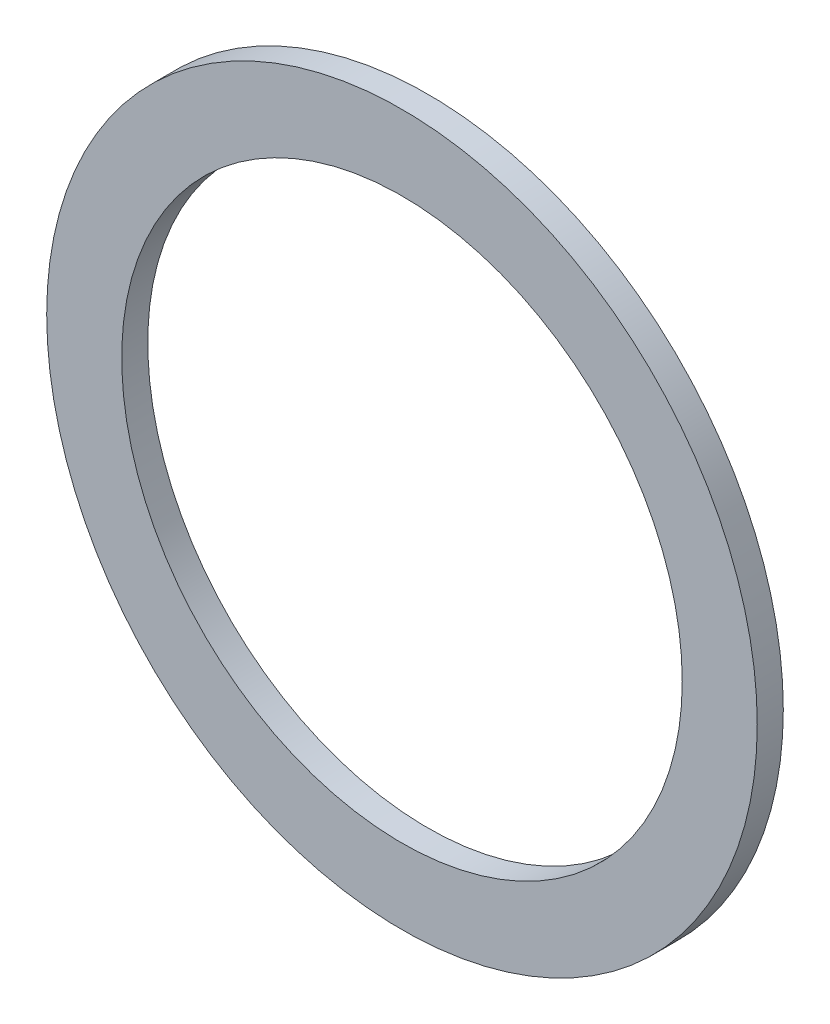
ISO-10303-21;
HEADER;
FILE_DESCRIPTION(('STEP AP214'),'2;1');
FILE_NAME('part.step','',(''),(''),'','','');
FILE_SCHEMA(('AUTOMOTIVE_DESIGN { 1 0 10303 214 1 1 1 1 }'));
ENDSEC;
DATA;
#1=APPLICATION_CONTEXT('core data for automotive mechanical design processes');
#2=APPLICATION_PROTOCOL_DEFINITION('international standard','automotive_design',2000,#1);
#3=PRODUCT_CONTEXT('',#1,'mechanical');
#4=PRODUCT('Part','Part','',(#3));
#5=PRODUCT_RELATED_PRODUCT_CATEGORY('part','',(#4));
#6=PRODUCT_DEFINITION_FORMATION('','',#4);
#7=PRODUCT_DEFINITION_CONTEXT('part definition',#1,'design');
#8=PRODUCT_DEFINITION('design','',#6,#7);
#9=PRODUCT_DEFINITION_SHAPE('','',#8);
#10=(LENGTH_UNIT() NAMED_UNIT(*) SI_UNIT(.MILLI.,.METRE.));
#11=(NAMED_UNIT(*) PLANE_ANGLE_UNIT() SI_UNIT($,.RADIAN.));
#12=(NAMED_UNIT(*) SI_UNIT($,.STERADIAN.) SOLID_ANGLE_UNIT());
#13=UNCERTAINTY_MEASURE_WITH_UNIT(LENGTH_MEASURE(1.E-05),#10,'distance_accuracy_value','');
#14=(GEOMETRIC_REPRESENTATION_CONTEXT(3) GLOBAL_UNCERTAINTY_ASSIGNED_CONTEXT((#13)) GLOBAL_UNIT_ASSIGNED_CONTEXT((#10,
#11,#12)) REPRESENTATION_CONTEXT('',''));
#15=CARTESIAN_POINT('',(0.,0.,0.));
#16=DIRECTION('',(0.,0.,1.));
#17=DIRECTION('',(1.,0.,0.));
#18=AXIS2_PLACEMENT_3D('',#15,#16,#17);
#19=CARTESIAN_POINT('',(0.,0.,1.65));
#20=DIRECTION('',(0.,0.,1.));
#21=DIRECTION('',(1.,0.,0.));
#22=AXIS2_PLACEMENT_3D('',#19,#20,#21);
#23=PLANE('',#22);
#24=CARTESIAN_POINT('',(0.,0.,1.65));
#25=DIRECTION('',(0.,0.,1.));
#26=DIRECTION('',(1.,0.,0.));
#27=AXIS2_PLACEMENT_3D('',#24,#25,#26);
#28=CIRCLE('',#27,22.5);
#29=CARTESIAN_POINT('',(22.5,0.,1.65));
#30=VERTEX_POINT('',#29);
#31=EDGE_CURVE('E10',#30,#30,#28,.T.);
#32=ORIENTED_EDGE('',*,*,#31,.T.);
#33=EDGE_LOOP('',(#32));
#34=FACE_BOUND('',#33,.T.);
#35=CARTESIAN_POINT('',(0.,0.,1.65));
#36=DIRECTION('',(0.,0.,1.));
#37=DIRECTION('',(1.,0.,0.));
#38=AXIS2_PLACEMENT_3D('',#35,#36,#37);
#39=CIRCLE('',#38,17.75);
#40=CARTESIAN_POINT('',(17.75,0.,1.65));
#41=VERTEX_POINT('',#40);
#42=EDGE_CURVE('E44',#41,#41,#39,.T.);
#43=ORIENTED_EDGE('',*,*,#42,.F.);
#44=EDGE_LOOP('',(#43));
#45=FACE_BOUND('',#44,.T.);
#46=ADVANCED_FACE('F33',(#34,#45),#23,.T.);
#47=CARTESIAN_POINT('',(0.,0.,0.));
#48=DIRECTION('',(0.,0.,1.));
#49=DIRECTION('',(1.,0.,0.));
#50=AXIS2_PLACEMENT_3D('',#47,#48,#49);
#51=PLANE('',#50);
#52=CARTESIAN_POINT('',(0.,0.,0.));
#53=DIRECTION('',(0.,0.,1.));
#54=DIRECTION('',(1.,0.,0.));
#55=AXIS2_PLACEMENT_3D('',#52,#53,#54);
#56=CIRCLE('',#55,22.5);
#57=CARTESIAN_POINT('',(22.5,0.,0.));
#58=VERTEX_POINT('',#57);
#59=EDGE_CURVE('E37',#58,#58,#56,.T.);
#60=ORIENTED_EDGE('',*,*,#59,.F.);
#61=EDGE_LOOP('',(#60));
#62=FACE_BOUND('',#61,.T.);
#63=CARTESIAN_POINT('',(0.,0.,0.));
#64=DIRECTION('',(0.,0.,1.));
#65=DIRECTION('',(1.,0.,0.));
#66=AXIS2_PLACEMENT_3D('',#63,#64,#65);
#67=CIRCLE('',#66,17.75);
#68=CARTESIAN_POINT('',(17.75,0.,0.));
#69=VERTEX_POINT('',#68);
#70=EDGE_CURVE('E46',#69,#69,#67,.T.);
#71=ORIENTED_EDGE('',*,*,#70,.T.);
#72=EDGE_LOOP('',(#71));
#73=FACE_BOUND('',#72,.T.);
#74=ADVANCED_FACE('F56',(#62,#73),#51,.F.);
#75=CARTESIAN_POINT('',(0.,0.,1.65));
#76=DIRECTION('',(0.,0.,-1.));
#77=DIRECTION('',(-1.,0.,0.));
#78=AXIS2_PLACEMENT_3D('',#75,#76,#77);
#79=CYLINDRICAL_SURFACE('',#78,22.5);
#80=ORIENTED_EDGE('',*,*,#31,.F.);
#81=EDGE_LOOP('',(#80));
#82=FACE_BOUND('',#81,.T.);
#83=ORIENTED_EDGE('',*,*,#59,.T.);
#84=EDGE_LOOP('',(#83));
#85=FACE_BOUND('',#84,.T.);
#86=ADVANCED_FACE('F35',(#82,#85),#79,.T.);
#87=CARTESIAN_POINT('',(0.,0.,1.65));
#88=DIRECTION('',(0.,0.,-1.));
#89=DIRECTION('',(-1.,0.,0.));
#90=AXIS2_PLACEMENT_3D('',#87,#88,#89);
#91=CYLINDRICAL_SURFACE('',#90,17.75);
#92=ORIENTED_EDGE('',*,*,#42,.T.);
#93=EDGE_LOOP('',(#92));
#94=FACE_BOUND('',#93,.T.);
#95=ORIENTED_EDGE('',*,*,#70,.F.);
#96=EDGE_LOOP('',(#95));
#97=FACE_BOUND('',#96,.T.);
#98=ADVANCED_FACE('F52',(#94,#97),#91,.F.);
#99=CLOSED_SHELL('',(#46,#74,#86,#98));
#100=MANIFOLD_SOLID_BREP('B2',#99);
#101=ADVANCED_BREP_SHAPE_REPRESENTATION('',(#18,#100),#14);
#102=SHAPE_DEFINITION_REPRESENTATION(#9,#101);
ENDSEC;
END-ISO-10303-21;
